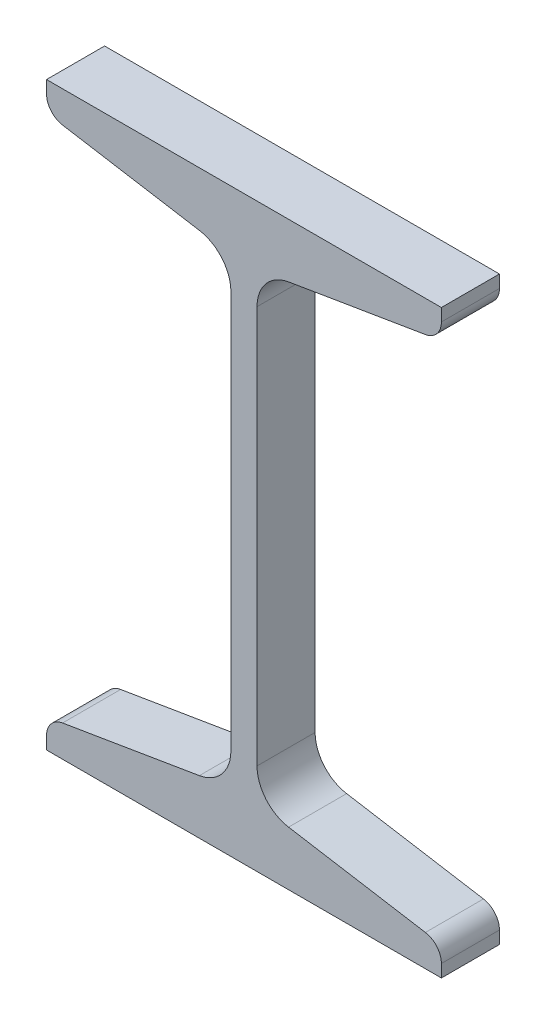
ISO-10303-21;
HEADER;
FILE_DESCRIPTION(('STEP AP214'),'2;1');
FILE_NAME('part.step','',(''),(''),'','','');
FILE_SCHEMA(('AUTOMOTIVE_DESIGN { 1 0 10303 214 1 1 1 1 }'));
ENDSEC;
DATA;
#1=APPLICATION_CONTEXT('core data for automotive mechanical design processes');
#2=APPLICATION_PROTOCOL_DEFINITION('international standard','automotive_design',2000,#1);
#3=PRODUCT_CONTEXT('',#1,'mechanical');
#4=PRODUCT('Part','Part','',(#3));
#5=PRODUCT_RELATED_PRODUCT_CATEGORY('part','',(#4));
#6=PRODUCT_DEFINITION_FORMATION('','',#4);
#7=PRODUCT_DEFINITION_CONTEXT('part definition',#1,'design');
#8=PRODUCT_DEFINITION('design','',#6,#7);
#9=PRODUCT_DEFINITION_SHAPE('','',#8);
#10=(LENGTH_UNIT() NAMED_UNIT(*) SI_UNIT(.MILLI.,.METRE.));
#11=(NAMED_UNIT(*) PLANE_ANGLE_UNIT() SI_UNIT($,.RADIAN.));
#12=(NAMED_UNIT(*) SI_UNIT($,.STERADIAN.) SOLID_ANGLE_UNIT());
#13=UNCERTAINTY_MEASURE_WITH_UNIT(LENGTH_MEASURE(1.E-05),#10,'distance_accuracy_value','');
#14=(GEOMETRIC_REPRESENTATION_CONTEXT(3) GLOBAL_UNCERTAINTY_ASSIGNED_CONTEXT((#13)) GLOBAL_UNIT_ASSIGNED_CONTEXT((#10,
#11,#12)) REPRESENTATION_CONTEXT('',''));
#15=CARTESIAN_POINT('',(0.,0.,0.));
#16=DIRECTION('',(0.,0.,1.));
#17=DIRECTION('',(1.,0.,0.));
#18=AXIS2_PLACEMENT_3D('',#15,#16,#17);
#19=CARTESIAN_POINT('',(34.,-50.,10.));
#20=DIRECTION('',(-1.,0.,0.));
#21=DIRECTION('',(0.,0.,1.));
#22=AXIS2_PLACEMENT_3D('',#19,#20,#21);
#23=PLANE('',#22);
#24=DIRECTION('',(0.,1.,0.));
#25=VECTOR('',#24,1.);
#26=CARTESIAN_POINT('',(34.,-50.,0.));
#27=LINE('',#26,#25);
#28=CARTESIAN_POINT('',(34.,-50.,0.));
#29=VERTEX_POINT('',#28);
#30=CARTESIAN_POINT('',(34.,-47.8413527249973,0.));
#31=VERTEX_POINT('',#30);
#32=EDGE_CURVE('E215',#29,#31,#27,.T.);
#33=ORIENTED_EDGE('',*,*,#32,.T.);
#34=DIRECTION('',(0.,0.,-1.));
#35=VECTOR('',#34,1.);
#36=CARTESIAN_POINT('',(34.,-47.8413527249973,10.));
#37=LINE('',#36,#35);
#38=CARTESIAN_POINT('',(34.,-47.8413527249973,10.));
#39=VERTEX_POINT('',#38);
#40=EDGE_CURVE('E263',#31,#39,#37,.F.);
#41=ORIENTED_EDGE('',*,*,#40,.T.);
#42=DIRECTION('',(0.,1.,0.));
#43=VECTOR('',#42,1.);
#44=CARTESIAN_POINT('',(34.,-50.,10.));
#45=LINE('',#44,#43);
#46=CARTESIAN_POINT('',(34.,-50.,10.));
#47=VERTEX_POINT('',#46);
#48=EDGE_CURVE('E244',#47,#39,#45,.T.);
#49=ORIENTED_EDGE('',*,*,#48,.F.);
#50=DIRECTION('',(0.,0.,-1.));
#51=VECTOR('',#50,1.);
#52=CARTESIAN_POINT('',(34.,-50.,10.));
#53=LINE('',#52,#51);
#54=EDGE_CURVE('E214',#47,#29,#53,.T.);
#55=ORIENTED_EDGE('',*,*,#54,.T.);
#56=EDGE_LOOP('',(#33,#41,#49,#55));
#57=FACE_BOUND('',#56,.T.);
#58=ADVANCED_FACE('F35',(#57),#23,.F.);
#59=CARTESIAN_POINT('',(34.,-45.0458333333332,10.));
#60=DIRECTION('',(-0.164398987305351,-0.986393923832145,0.));
#61=DIRECTION('',(0.986393923832145,-0.164398987305351,0.));
#62=AXIS2_PLACEMENT_3D('',#59,#60,#61);
#63=PLANE('',#62);
#64=DIRECTION('',(-0.986393923832145,0.164398987305351,0.));
#65=VECTOR('',#64,1.);
#66=CARTESIAN_POINT('',(34.,-45.0458333333332,0.));
#67=LINE('',#66,#65);
#68=CARTESIAN_POINT('',(31.2425166581077,-44.5862527763512,0.));
#69=VERTEX_POINT('',#68);
#70=CARTESIAN_POINT('',(7.68140658251523,-40.6594010970859,0.));
#71=VERTEX_POINT('',#70);
#72=EDGE_CURVE('E218',#69,#71,#67,.T.);
#73=ORIENTED_EDGE('',*,*,#72,.T.);
#74=DIRECTION('',(0.,0.,-1.));
#75=VECTOR('',#74,1.);
#76=CARTESIAN_POINT('',(7.68140658251523,-40.6594010970859,10.));
#77=LINE('',#76,#75);
#78=CARTESIAN_POINT('',(7.68140658251523,-40.6594010970859,10.));
#79=VERTEX_POINT('',#78);
#80=EDGE_CURVE('E303',#71,#79,#77,.F.);
#81=ORIENTED_EDGE('',*,*,#80,.T.);
#82=DIRECTION('',(-0.986393923832145,0.164398987305351,0.));
#83=VECTOR('',#82,1.);
#84=CARTESIAN_POINT('',(34.,-45.0458333333332,10.));
#85=LINE('',#84,#83);
#86=CARTESIAN_POINT('',(31.2425166581077,-44.5862527763512,10.));
#87=VERTEX_POINT('',#86);
#88=EDGE_CURVE('E331',#87,#79,#85,.T.);
#89=ORIENTED_EDGE('',*,*,#88,.F.);
#90=DIRECTION('',(0.,0.,-1.));
#91=VECTOR('',#90,1.);
#92=CARTESIAN_POINT('',(31.2425166581077,-44.5862527763512,10.));
#93=LINE('',#92,#91);
#94=EDGE_CURVE('E191',#87,#69,#93,.T.);
#95=ORIENTED_EDGE('',*,*,#94,.T.);
#96=EDGE_LOOP('',(#73,#81,#89,#95));
#97=FACE_BOUND('',#96,.T.);
#98=ADVANCED_FACE('F347',(#97),#63,.F.);
#99=CARTESIAN_POINT('',(2.25000000000001,39.7541666666668,10.));
#100=DIRECTION('',(-1.,0.,0.));
#101=DIRECTION('',(0.,0.,1.));
#102=AXIS2_PLACEMENT_3D('',#99,#100,#101);
#103=PLANE('',#102);
#104=DIRECTION('',(0.,1.,0.));
#105=VECTOR('',#104,1.);
#106=CARTESIAN_POINT('',(2.25000000000001,39.7541666666668,10.));
#107=LINE('',#106,#105);
#108=CARTESIAN_POINT('',(2.25000000000001,-34.247840592177,10.));
#109=VERTEX_POINT('',#108);
#110=CARTESIAN_POINT('',(2.25000000000001,34.247840592177,10.));
#111=VERTEX_POINT('',#110);
#112=EDGE_CURVE('E330',#109,#111,#107,.T.);
#113=ORIENTED_EDGE('',*,*,#112,.F.);
#114=DIRECTION('',(0.,0.,-1.));
#115=VECTOR('',#114,1.);
#116=CARTESIAN_POINT('',(2.25000000000001,-34.247840592177,0.));
#117=LINE('',#116,#115);
#118=CARTESIAN_POINT('',(2.25000000000001,-34.247840592177,0.));
#119=VERTEX_POINT('',#118);
#120=EDGE_CURVE('E300',#109,#119,#117,.T.);
#121=ORIENTED_EDGE('',*,*,#120,.T.);
#122=DIRECTION('',(0.,1.,0.));
#123=VECTOR('',#122,1.);
#124=CARTESIAN_POINT('',(2.25000000000001,39.7541666666668,0.));
#125=LINE('',#124,#123);
#126=CARTESIAN_POINT('',(2.25000000000001,34.247840592177,0.));
#127=VERTEX_POINT('',#126);
#128=EDGE_CURVE('E221',#119,#127,#125,.T.);
#129=ORIENTED_EDGE('',*,*,#128,.T.);
#130=DIRECTION('',(0.,0.,-1.));
#131=VECTOR('',#130,1.);
#132=CARTESIAN_POINT('',(2.25000000000001,34.247840592177,10.));
#133=LINE('',#132,#131);
#134=EDGE_CURVE('E298',#127,#111,#133,.F.);
#135=ORIENTED_EDGE('',*,*,#134,.T.);
#136=EDGE_LOOP('',(#113,#121,#129,#135));
#137=FACE_BOUND('',#136,.T.);
#138=ADVANCED_FACE('F325',(#137),#103,.F.);
#139=CARTESIAN_POINT('',(34.,45.0458333333332,10.));
#140=DIRECTION('',(-0.164398987305351,0.986393923832145,0.));
#141=DIRECTION('',(-0.986393923832145,-0.164398987305351,0.));
#142=AXIS2_PLACEMENT_3D('',#139,#140,#141);
#143=PLANE('',#142);
#144=DIRECTION('',(0.986393923832145,0.164398987305351,0.));
#145=VECTOR('',#144,1.);
#146=CARTESIAN_POINT('',(34.,45.0458333333332,10.));
#147=LINE('',#146,#145);
#148=CARTESIAN_POINT('',(7.68140658251523,40.6594010970859,10.));
#149=VERTEX_POINT('',#148);
#150=CARTESIAN_POINT('',(31.2425166581077,44.5862527763512,10.));
#151=VERTEX_POINT('',#150);
#152=EDGE_CURVE('E182',#149,#151,#147,.T.);
#153=ORIENTED_EDGE('',*,*,#152,.F.);
#154=DIRECTION('',(0.,0.,-1.));
#155=VECTOR('',#154,1.);
#156=CARTESIAN_POINT('',(7.68140658251523,40.6594010970859,0.));
#157=LINE('',#156,#155);
#158=CARTESIAN_POINT('',(7.68140658251523,40.6594010970859,0.));
#159=VERTEX_POINT('',#158);
#160=EDGE_CURVE('E305',#149,#159,#157,.T.);
#161=ORIENTED_EDGE('',*,*,#160,.T.);
#162=DIRECTION('',(0.986393923832145,0.164398987305351,0.));
#163=VECTOR('',#162,1.);
#164=CARTESIAN_POINT('',(34.,45.0458333333332,0.));
#165=LINE('',#164,#163);
#166=CARTESIAN_POINT('',(31.2425166581077,44.5862527763512,0.));
#167=VERTEX_POINT('',#166);
#168=EDGE_CURVE('E224',#159,#167,#165,.T.);
#169=ORIENTED_EDGE('',*,*,#168,.T.);
#170=DIRECTION('',(0.,0.,-1.));
#171=VECTOR('',#170,1.);
#172=CARTESIAN_POINT('',(31.2425166581077,44.5862527763512,10.));
#173=LINE('',#172,#171);
#174=EDGE_CURVE('E285',#167,#151,#173,.F.);
#175=ORIENTED_EDGE('',*,*,#174,.T.);
#176=EDGE_LOOP('',(#153,#161,#169,#175));
#177=FACE_BOUND('',#176,.T.);
#178=ADVANCED_FACE('F328',(#177),#143,.F.);
#179=CARTESIAN_POINT('',(34.,50.,10.));
#180=DIRECTION('',(-1.,0.,0.));
#181=DIRECTION('',(0.,0.,1.));
#182=AXIS2_PLACEMENT_3D('',#179,#180,#181);
#183=PLANE('',#182);
#184=DIRECTION('',(0.,1.,0.));
#185=VECTOR('',#184,1.);
#186=CARTESIAN_POINT('',(34.,50.,10.));
#187=LINE('',#186,#185);
#188=CARTESIAN_POINT('',(34.,47.8413527249973,10.));
#189=VERTEX_POINT('',#188);
#190=CARTESIAN_POINT('',(34.,50.,10.));
#191=VERTEX_POINT('',#190);
#192=EDGE_CURVE('E169',#189,#191,#187,.T.);
#193=ORIENTED_EDGE('',*,*,#192,.F.);
#194=DIRECTION('',(0.,0.,-1.));
#195=VECTOR('',#194,1.);
#196=CARTESIAN_POINT('',(34.,47.8413527249973,10.));
#197=LINE('',#196,#195);
#198=CARTESIAN_POINT('',(34.,47.8413527249973,0.));
#199=VERTEX_POINT('',#198);
#200=EDGE_CURVE('E283',#189,#199,#197,.T.);
#201=ORIENTED_EDGE('',*,*,#200,.T.);
#202=DIRECTION('',(0.,1.,0.));
#203=VECTOR('',#202,1.);
#204=CARTESIAN_POINT('',(34.,50.,0.));
#205=LINE('',#204,#203);
#206=CARTESIAN_POINT('',(34.,50.,0.));
#207=VERTEX_POINT('',#206);
#208=EDGE_CURVE('E188',#199,#207,#205,.T.);
#209=ORIENTED_EDGE('',*,*,#208,.T.);
#210=DIRECTION('',(0.,0.,-1.));
#211=VECTOR('',#210,1.);
#212=CARTESIAN_POINT('',(34.,50.,10.));
#213=LINE('',#212,#211);
#214=EDGE_CURVE('E185',#191,#207,#213,.T.);
#215=ORIENTED_EDGE('',*,*,#214,.F.);
#216=EDGE_LOOP('',(#193,#201,#209,#215));
#217=FACE_BOUND('',#216,.T.);
#218=ADVANCED_FACE('F186',(#217),#183,.F.);
#219=CARTESIAN_POINT('',(34.,50.,10.));
#220=DIRECTION('',(0.,-1.,0.));
#221=DIRECTION('',(1.,0.,0.));
#222=AXIS2_PLACEMENT_3D('',#219,#220,#221);
#223=PLANE('',#222);
#224=DIRECTION('',(-1.,0.,0.));
#225=VECTOR('',#224,1.);
#226=CARTESIAN_POINT('',(34.,50.,0.));
#227=LINE('',#226,#225);
#228=CARTESIAN_POINT('',(-34.,50.,0.));
#229=VERTEX_POINT('',#228);
#230=EDGE_CURVE('E227',#207,#229,#227,.T.);
#231=ORIENTED_EDGE('',*,*,#230,.T.);
#232=DIRECTION('',(0.,0.,-1.));
#233=VECTOR('',#232,1.);
#234=CARTESIAN_POINT('',(-34.,50.,10.));
#235=LINE('',#234,#233);
#236=CARTESIAN_POINT('',(-34.,50.,10.));
#237=VERTEX_POINT('',#236);
#238=EDGE_CURVE('E192',#237,#229,#235,.T.);
#239=ORIENTED_EDGE('',*,*,#238,.F.);
#240=DIRECTION('',(-1.,0.,0.));
#241=VECTOR('',#240,1.);
#242=CARTESIAN_POINT('',(34.,50.,10.));
#243=LINE('',#242,#241);
#244=EDGE_CURVE('E175',#191,#237,#243,.T.);
#245=ORIENTED_EDGE('',*,*,#244,.F.);
#246=ORIENTED_EDGE('',*,*,#214,.T.);
#247=EDGE_LOOP('',(#231,#239,#245,#246));
#248=FACE_BOUND('',#247,.T.);
#249=ADVANCED_FACE('F194',(#248),#223,.F.);
#250=CARTESIAN_POINT('',(-34.,50.,10.));
#251=DIRECTION('',(1.,0.,0.));
#252=DIRECTION('',(0.,0.,-1.));
#253=AXIS2_PLACEMENT_3D('',#250,#251,#252);
#254=PLANE('',#253);
#255=DIRECTION('',(0.,-1.,0.));
#256=VECTOR('',#255,1.);
#257=CARTESIAN_POINT('',(-34.,50.,0.));
#258=LINE('',#257,#256);
#259=CARTESIAN_POINT('',(-34.,47.8413527249972,0.));
#260=VERTEX_POINT('',#259);
#261=EDGE_CURVE('E229',#229,#260,#258,.T.);
#262=ORIENTED_EDGE('',*,*,#261,.T.);
#263=DIRECTION('',(0.,0.,-1.));
#264=VECTOR('',#263,1.);
#265=CARTESIAN_POINT('',(-34.,47.8413527249972,10.));
#266=LINE('',#265,#264);
#267=CARTESIAN_POINT('',(-34.,47.8413527249972,10.));
#268=VERTEX_POINT('',#267);
#269=EDGE_CURVE('E281',#260,#268,#266,.F.);
#270=ORIENTED_EDGE('',*,*,#269,.T.);
#271=DIRECTION('',(0.,-1.,0.));
#272=VECTOR('',#271,1.);
#273=CARTESIAN_POINT('',(-34.,50.,10.));
#274=LINE('',#273,#272);
#275=EDGE_CURVE('E197',#237,#268,#274,.T.);
#276=ORIENTED_EDGE('',*,*,#275,.F.);
#277=ORIENTED_EDGE('',*,*,#238,.T.);
#278=EDGE_LOOP('',(#262,#270,#276,#277));
#279=FACE_BOUND('',#278,.T.);
#280=ADVANCED_FACE('F422',(#279),#254,.F.);
#281=CARTESIAN_POINT('',(-34.,45.0458333333332,10.));
#282=DIRECTION('',(0.164398987305351,0.986393923832145,0.));
#283=DIRECTION('',(-0.986393923832145,0.164398987305351,0.));
#284=AXIS2_PLACEMENT_3D('',#281,#282,#283);
#285=PLANE('',#284);
#286=DIRECTION('',(0.986393923832145,-0.164398987305351,0.));
#287=VECTOR('',#286,1.);
#288=CARTESIAN_POINT('',(-34.,45.0458333333332,0.));
#289=LINE('',#288,#287);
#290=CARTESIAN_POINT('',(-31.2425166581077,44.5862527763512,0.));
#291=VERTEX_POINT('',#290);
#292=CARTESIAN_POINT('',(-7.68140658251523,40.6594010970859,0.));
#293=VERTEX_POINT('',#292);
#294=EDGE_CURVE('E232',#291,#293,#289,.T.);
#295=ORIENTED_EDGE('',*,*,#294,.T.);
#296=DIRECTION('',(0.,0.,-1.));
#297=VECTOR('',#296,1.);
#298=CARTESIAN_POINT('',(-7.68140658251523,40.6594010970859,10.));
#299=LINE('',#298,#297);
#300=CARTESIAN_POINT('',(-7.68140658251523,40.6594010970859,10.));
#301=VERTEX_POINT('',#300);
#302=EDGE_CURVE('E296',#293,#301,#299,.F.);
#303=ORIENTED_EDGE('',*,*,#302,.T.);
#304=DIRECTION('',(0.986393923832145,-0.164398987305351,0.));
#305=VECTOR('',#304,1.);
#306=CARTESIAN_POINT('',(-34.,45.0458333333332,10.));
#307=LINE('',#306,#305);
#308=CARTESIAN_POINT('',(-31.2425166581077,44.5862527763512,10.));
#309=VERTEX_POINT('',#308);
#310=EDGE_CURVE('E199',#309,#301,#307,.T.);
#311=ORIENTED_EDGE('',*,*,#310,.F.);
#312=DIRECTION('',(0.,0.,-1.));
#313=VECTOR('',#312,1.);
#314=CARTESIAN_POINT('',(-31.2425166581077,44.5862527763512,10.));
#315=LINE('',#314,#313);
#316=EDGE_CURVE('E278',#309,#291,#315,.T.);
#317=ORIENTED_EDGE('',*,*,#316,.T.);
#318=EDGE_LOOP('',(#295,#303,#311,#317));
#319=FACE_BOUND('',#318,.T.);
#320=ADVANCED_FACE('F415',(#319),#285,.F.);
#321=CARTESIAN_POINT('',(-2.25000000000001,39.7541666666668,10.));
#322=DIRECTION('',(1.,0.,0.));
#323=DIRECTION('',(0.,1.,0.));
#324=AXIS2_PLACEMENT_3D('',#321,#322,#323);
#325=PLANE('',#324);
#326=DIRECTION('',(0.,-1.,0.));
#327=VECTOR('',#326,1.);
#328=CARTESIAN_POINT('',(-2.25000000000001,39.7541666666668,0.));
#329=LINE('',#328,#327);
#330=CARTESIAN_POINT('',(-2.25000000000001,34.247840592177,0.));
#331=VERTEX_POINT('',#330);
#332=CARTESIAN_POINT('',(-2.24999999999999,-34.247840592177,0.));
#333=VERTEX_POINT('',#332);
#334=EDGE_CURVE('E235',#331,#333,#329,.T.);
#335=ORIENTED_EDGE('',*,*,#334,.T.);
#336=DIRECTION('',(0.,0.,-1.));
#337=VECTOR('',#336,1.);
#338=CARTESIAN_POINT('',(-2.24999999999999,-34.247840592177,10.));
#339=LINE('',#338,#337);
#340=CARTESIAN_POINT('',(-2.24999999999999,-34.247840592177,10.));
#341=VERTEX_POINT('',#340);
#342=EDGE_CURVE('E294',#333,#341,#339,.F.);
#343=ORIENTED_EDGE('',*,*,#342,.T.);
#344=DIRECTION('',(0.,-1.,0.));
#345=VECTOR('',#344,1.);
#346=CARTESIAN_POINT('',(-2.25000000000001,39.7541666666668,10.));
#347=LINE('',#346,#345);
#348=CARTESIAN_POINT('',(-2.25000000000001,34.247840592177,10.));
#349=VERTEX_POINT('',#348);
#350=EDGE_CURVE('E205',#349,#341,#347,.T.);
#351=ORIENTED_EDGE('',*,*,#350,.F.);
#352=DIRECTION('',(0.,0.,-1.));
#353=VECTOR('',#352,1.);
#354=CARTESIAN_POINT('',(-2.25000000000001,34.247840592177,0.));
#355=LINE('',#354,#353);
#356=EDGE_CURVE('E291',#349,#331,#355,.T.);
#357=ORIENTED_EDGE('',*,*,#356,.T.);
#358=EDGE_LOOP('',(#335,#343,#351,#357));
#359=FACE_BOUND('',#358,.T.);
#360=ADVANCED_FACE('F409',(#359),#325,.F.);
#361=CARTESIAN_POINT('',(-34.,-45.0458333333332,10.));
#362=DIRECTION('',(0.164398987305351,-0.986393923832145,0.));
#363=DIRECTION('',(0.986393923832145,0.164398987305351,0.));
#364=AXIS2_PLACEMENT_3D('',#361,#362,#363);
#365=PLANE('',#364);
#366=DIRECTION('',(-0.986393923832145,-0.164398987305351,0.));
#367=VECTOR('',#366,1.);
#368=CARTESIAN_POINT('',(-34.,-45.0458333333332,10.));
#369=LINE('',#368,#367);
#370=CARTESIAN_POINT('',(-7.68140658251521,-40.6594010970859,10.));
#371=VERTEX_POINT('',#370);
#372=CARTESIAN_POINT('',(-31.2425166581076,-44.5862527763512,10.));
#373=VERTEX_POINT('',#372);
#374=EDGE_CURVE('E208',#371,#373,#369,.T.);
#375=ORIENTED_EDGE('',*,*,#374,.F.);
#376=DIRECTION('',(0.,0.,-1.));
#377=VECTOR('',#376,1.);
#378=CARTESIAN_POINT('',(-7.6814065825152,-40.6594010970859,0.));
#379=LINE('',#378,#377);
#380=CARTESIAN_POINT('',(-7.68140658251521,-40.6594010970859,0.));
#381=VERTEX_POINT('',#380);
#382=EDGE_CURVE('E288',#371,#381,#379,.T.);
#383=ORIENTED_EDGE('',*,*,#382,.T.);
#384=DIRECTION('',(-0.986393923832145,-0.164398987305351,0.));
#385=VECTOR('',#384,1.);
#386=CARTESIAN_POINT('',(-34.,-45.0458333333332,0.));
#387=LINE('',#386,#385);
#388=CARTESIAN_POINT('',(-31.2425166581076,-44.5862527763512,0.));
#389=VERTEX_POINT('',#388);
#390=EDGE_CURVE('E238',#381,#389,#387,.T.);
#391=ORIENTED_EDGE('',*,*,#390,.T.);
#392=DIRECTION('',(0.,0.,-1.));
#393=VECTOR('',#392,1.);
#394=CARTESIAN_POINT('',(-31.2425166581076,-44.5862527763512,10.));
#395=LINE('',#394,#393);
#396=EDGE_CURVE('E275',#389,#373,#395,.F.);
#397=ORIENTED_EDGE('',*,*,#396,.T.);
#398=EDGE_LOOP('',(#375,#383,#391,#397));
#399=FACE_BOUND('',#398,.T.);
#400=ADVANCED_FACE('F394',(#399),#365,.F.);
#401=CARTESIAN_POINT('',(-34.,-50.,10.));
#402=DIRECTION('',(1.,0.,0.));
#403=DIRECTION('',(0.,0.,-1.));
#404=AXIS2_PLACEMENT_3D('',#401,#402,#403);
#405=PLANE('',#404);
#406=DIRECTION('',(0.,-1.,0.));
#407=VECTOR('',#406,1.);
#408=CARTESIAN_POINT('',(-34.,-50.,10.));
#409=LINE('',#408,#407);
#410=CARTESIAN_POINT('',(-34.,-47.8413527249973,10.));
#411=VERTEX_POINT('',#410);
#412=CARTESIAN_POINT('',(-34.,-50.,10.));
#413=VERTEX_POINT('',#412);
#414=EDGE_CURVE('E210',#411,#413,#409,.T.);
#415=ORIENTED_EDGE('',*,*,#414,.F.);
#416=DIRECTION('',(0.,0.,-1.));
#417=VECTOR('',#416,1.);
#418=CARTESIAN_POINT('',(-34.,-47.8413527249973,10.));
#419=LINE('',#418,#417);
#420=CARTESIAN_POINT('',(-34.,-47.8413527249973,0.));
#421=VERTEX_POINT('',#420);
#422=EDGE_CURVE('E272',#411,#421,#419,.T.);
#423=ORIENTED_EDGE('',*,*,#422,.T.);
#424=DIRECTION('',(0.,-1.,0.));
#425=VECTOR('',#424,1.);
#426=CARTESIAN_POINT('',(-34.,-50.,0.));
#427=LINE('',#426,#425);
#428=CARTESIAN_POINT('',(-34.,-50.,0.));
#429=VERTEX_POINT('',#428);
#430=EDGE_CURVE('E240',#421,#429,#427,.T.);
#431=ORIENTED_EDGE('',*,*,#430,.T.);
#432=DIRECTION('',(0.,0.,-1.));
#433=VECTOR('',#432,1.);
#434=CARTESIAN_POINT('',(-34.,-50.,10.));
#435=LINE('',#434,#433);
#436=EDGE_CURVE('E247',#413,#429,#435,.T.);
#437=ORIENTED_EDGE('',*,*,#436,.F.);
#438=EDGE_LOOP('',(#415,#423,#431,#437));
#439=FACE_BOUND('',#438,.T.);
#440=ADVANCED_FACE('F402',(#439),#405,.F.);
#441=CARTESIAN_POINT('',(34.,-50.,10.));
#442=DIRECTION('',(0.,1.,0.));
#443=DIRECTION('',(-1.,0.,0.));
#444=AXIS2_PLACEMENT_3D('',#441,#442,#443);
#445=PLANE('',#444);
#446=DIRECTION('',(1.,0.,0.));
#447=VECTOR('',#446,1.);
#448=CARTESIAN_POINT('',(34.,-50.,0.));
#449=LINE('',#448,#447);
#450=EDGE_CURVE('E242',#429,#29,#449,.T.);
#451=ORIENTED_EDGE('',*,*,#450,.T.);
#452=ORIENTED_EDGE('',*,*,#54,.F.);
#453=DIRECTION('',(1.,0.,0.));
#454=VECTOR('',#453,1.);
#455=CARTESIAN_POINT('',(34.,-50.,10.));
#456=LINE('',#455,#454);
#457=EDGE_CURVE('E212',#413,#47,#456,.T.);
#458=ORIENTED_EDGE('',*,*,#457,.F.);
#459=ORIENTED_EDGE('',*,*,#436,.T.);
#460=EDGE_LOOP('',(#451,#452,#458,#459));
#461=FACE_BOUND('',#460,.T.);
#462=ADVANCED_FACE('F406',(#461),#445,.F.);
#463=CARTESIAN_POINT('',(34.,50.,10.));
#464=DIRECTION('',(0.,0.,1.));
#465=DIRECTION('',(1.,0.,0.));
#466=AXIS2_PLACEMENT_3D('',#463,#464,#465);
#467=PLANE('',#466);
#468=ORIENTED_EDGE('',*,*,#48,.T.);
#469=CARTESIAN_POINT('',(30.7,-47.8413527249973,10.));
#470=DIRECTION('',(0.,0.,1.));
#471=DIRECTION('',(1.,0.,0.));
#472=AXIS2_PLACEMENT_3D('',#469,#470,#471);
#473=CIRCLE('',#472,3.3);
#474=EDGE_CURVE('E270',#39,#87,#473,.T.);
#475=ORIENTED_EDGE('',*,*,#474,.T.);
#476=ORIENTED_EDGE('',*,*,#88,.T.);
#477=CARTESIAN_POINT('',(8.75000000000001,-34.247840592177,10.));
#478=DIRECTION('',(0.,0.,1.));
#479=DIRECTION('',(1.,0.,0.));
#480=AXIS2_PLACEMENT_3D('',#477,#478,#479);
#481=CIRCLE('',#480,6.5);
#482=EDGE_CURVE('E317',#79,#109,#481,.F.);
#483=ORIENTED_EDGE('',*,*,#482,.T.);
#484=ORIENTED_EDGE('',*,*,#112,.T.);
#485=CARTESIAN_POINT('',(8.75000000000001,34.247840592177,10.));
#486=DIRECTION('',(0.,0.,1.));
#487=DIRECTION('',(1.,0.,0.));
#488=AXIS2_PLACEMENT_3D('',#485,#486,#487);
#489=CIRCLE('',#488,6.5);
#490=EDGE_CURVE('E11',#111,#149,#489,.F.);
#491=ORIENTED_EDGE('',*,*,#490,.T.);
#492=ORIENTED_EDGE('',*,*,#152,.T.);
#493=CARTESIAN_POINT('',(30.7,47.8413527249973,10.));
#494=DIRECTION('',(0.,0.,1.));
#495=DIRECTION('',(1.,0.,0.));
#496=AXIS2_PLACEMENT_3D('',#493,#494,#495);
#497=CIRCLE('',#496,3.3);
#498=EDGE_CURVE('E178',#151,#189,#497,.T.);
#499=ORIENTED_EDGE('',*,*,#498,.T.);
#500=ORIENTED_EDGE('',*,*,#192,.T.);
#501=ORIENTED_EDGE('',*,*,#244,.T.);
#502=ORIENTED_EDGE('',*,*,#275,.T.);
#503=CARTESIAN_POINT('',(-30.7,47.8413527249972,10.));
#504=DIRECTION('',(0.,0.,1.));
#505=DIRECTION('',(1.,0.,0.));
#506=AXIS2_PLACEMENT_3D('',#503,#504,#505);
#507=CIRCLE('',#506,3.3);
#508=EDGE_CURVE('E266',#268,#309,#507,.T.);
#509=ORIENTED_EDGE('',*,*,#508,.T.);
#510=ORIENTED_EDGE('',*,*,#310,.T.);
#511=CARTESIAN_POINT('',(-8.75000000000001,34.247840592177,10.));
#512=DIRECTION('',(0.,0.,1.));
#513=DIRECTION('',(1.,0.,0.));
#514=AXIS2_PLACEMENT_3D('',#511,#512,#513);
#515=CIRCLE('',#514,6.5);
#516=EDGE_CURVE('E313',#301,#349,#515,.F.);
#517=ORIENTED_EDGE('',*,*,#516,.T.);
#518=ORIENTED_EDGE('',*,*,#350,.T.);
#519=CARTESIAN_POINT('',(-8.74999999999999,-34.247840592177,10.));
#520=DIRECTION('',(0.,0.,1.));
#521=DIRECTION('',(1.,0.,0.));
#522=AXIS2_PLACEMENT_3D('',#519,#520,#521);
#523=CIRCLE('',#522,6.5);
#524=EDGE_CURVE('E309',#341,#371,#523,.F.);
#525=ORIENTED_EDGE('',*,*,#524,.T.);
#526=ORIENTED_EDGE('',*,*,#374,.T.);
#527=CARTESIAN_POINT('',(-30.7,-47.8413527249973,10.));
#528=DIRECTION('',(0.,0.,1.));
#529=DIRECTION('',(1.,0.,0.));
#530=AXIS2_PLACEMENT_3D('',#527,#528,#529);
#531=CIRCLE('',#530,3.3);
#532=EDGE_CURVE('E268',#373,#411,#531,.T.);
#533=ORIENTED_EDGE('',*,*,#532,.T.);
#534=ORIENTED_EDGE('',*,*,#414,.T.);
#535=ORIENTED_EDGE('',*,*,#457,.T.);
#536=EDGE_LOOP('',(#468,#475,#476,#483,#484,#491,#492,#499,#500,#501,#502,#509,#510,#517,#518,
#525,#526,#533,#534,#535));
#537=FACE_BOUND('',#536,.T.);
#538=ADVANCED_FACE('F172',(#537),#467,.T.);
#539=CARTESIAN_POINT('',(34.,50.,0.));
#540=DIRECTION('',(0.,0.,1.));
#541=DIRECTION('',(1.,0.,0.));
#542=AXIS2_PLACEMENT_3D('',#539,#540,#541);
#543=PLANE('',#542);
#544=ORIENTED_EDGE('',*,*,#72,.F.);
#545=CARTESIAN_POINT('',(30.7,-47.8413527249973,0.));
#546=DIRECTION('',(0.,0.,1.));
#547=DIRECTION('',(1.,0.,0.));
#548=AXIS2_PLACEMENT_3D('',#545,#546,#547);
#549=CIRCLE('',#548,3.3);
#550=EDGE_CURVE('E261',#69,#31,#549,.F.);
#551=ORIENTED_EDGE('',*,*,#550,.T.);
#552=ORIENTED_EDGE('',*,*,#32,.F.);
#553=ORIENTED_EDGE('',*,*,#450,.F.);
#554=ORIENTED_EDGE('',*,*,#430,.F.);
#555=CARTESIAN_POINT('',(-30.7,-47.8413527249973,0.));
#556=DIRECTION('',(0.,0.,1.));
#557=DIRECTION('',(1.,0.,0.));
#558=AXIS2_PLACEMENT_3D('',#555,#556,#557);
#559=CIRCLE('',#558,3.3);
#560=EDGE_CURVE('E258',#421,#389,#559,.F.);
#561=ORIENTED_EDGE('',*,*,#560,.T.);
#562=ORIENTED_EDGE('',*,*,#390,.F.);
#563=CARTESIAN_POINT('',(-8.74999999999999,-34.247840592177,0.));
#564=DIRECTION('',(0.,0.,1.));
#565=DIRECTION('',(1.,0.,0.));
#566=AXIS2_PLACEMENT_3D('',#563,#564,#565);
#567=CIRCLE('',#566,6.5);
#568=EDGE_CURVE('E307',#381,#333,#567,.T.);
#569=ORIENTED_EDGE('',*,*,#568,.T.);
#570=ORIENTED_EDGE('',*,*,#334,.F.);
#571=CARTESIAN_POINT('',(-8.75000000000001,34.247840592177,0.));
#572=DIRECTION('',(0.,0.,1.));
#573=DIRECTION('',(1.,0.,0.));
#574=AXIS2_PLACEMENT_3D('',#571,#572,#573);
#575=CIRCLE('',#574,6.5);
#576=EDGE_CURVE('E311',#331,#293,#575,.T.);
#577=ORIENTED_EDGE('',*,*,#576,.T.);
#578=ORIENTED_EDGE('',*,*,#294,.F.);
#579=CARTESIAN_POINT('',(-30.7,47.8413527249972,0.));
#580=DIRECTION('',(0.,0.,1.));
#581=DIRECTION('',(1.,0.,0.));
#582=AXIS2_PLACEMENT_3D('',#579,#580,#581);
#583=CIRCLE('',#582,3.3);
#584=EDGE_CURVE('E256',#291,#260,#583,.F.);
#585=ORIENTED_EDGE('',*,*,#584,.T.);
#586=ORIENTED_EDGE('',*,*,#261,.F.);
#587=ORIENTED_EDGE('',*,*,#230,.F.);
#588=ORIENTED_EDGE('',*,*,#208,.F.);
#589=CARTESIAN_POINT('',(30.7,47.8413527249973,0.));
#590=DIRECTION('',(0.,0.,1.));
#591=DIRECTION('',(1.,0.,0.));
#592=AXIS2_PLACEMENT_3D('',#589,#590,#591);
#593=CIRCLE('',#592,3.3);
#594=EDGE_CURVE('E253',#199,#167,#593,.F.);
#595=ORIENTED_EDGE('',*,*,#594,.T.);
#596=ORIENTED_EDGE('',*,*,#168,.F.);
#597=CARTESIAN_POINT('',(8.75000000000001,34.247840592177,0.));
#598=DIRECTION('',(0.,0.,1.));
#599=DIRECTION('',(1.,0.,0.));
#600=AXIS2_PLACEMENT_3D('',#597,#598,#599);
#601=CIRCLE('',#600,6.5);
#602=EDGE_CURVE('E43',#159,#127,#601,.T.);
#603=ORIENTED_EDGE('',*,*,#602,.T.);
#604=ORIENTED_EDGE('',*,*,#128,.F.);
#605=CARTESIAN_POINT('',(8.75000000000001,-34.247840592177,0.));
#606=DIRECTION('',(0.,0.,1.));
#607=DIRECTION('',(1.,0.,0.));
#608=AXIS2_PLACEMENT_3D('',#605,#606,#607);
#609=CIRCLE('',#608,6.5);
#610=EDGE_CURVE('E315',#119,#71,#609,.T.);
#611=ORIENTED_EDGE('',*,*,#610,.T.);
#612=EDGE_LOOP('',(#544,#551,#552,#553,#554,#561,#562,#569,#570,#577,#578,#585,#586,#587,#588,
#595,#596,#603,#604,#611));
#613=FACE_BOUND('',#612,.T.);
#614=ADVANCED_FACE('F322',(#613),#543,.F.);
#615=CARTESIAN_POINT('',(30.7,-47.8413527249973,10.));
#616=DIRECTION('',(0.,0.,-1.));
#617=DIRECTION('',(-1.,0.,0.));
#618=AXIS2_PLACEMENT_3D('',#615,#616,#617);
#619=CYLINDRICAL_SURFACE('',#618,3.3);
#620=ORIENTED_EDGE('',*,*,#474,.F.);
#621=ORIENTED_EDGE('',*,*,#40,.F.);
#622=ORIENTED_EDGE('',*,*,#550,.F.);
#623=ORIENTED_EDGE('',*,*,#94,.F.);
#624=EDGE_LOOP('',(#620,#621,#622,#623));
#625=FACE_BOUND('',#624,.T.);
#626=ADVANCED_FACE('F345',(#625),#619,.T.);
#627=CARTESIAN_POINT('',(-30.7,-47.8413527249973,10.));
#628=DIRECTION('',(0.,0.,-1.));
#629=DIRECTION('',(-1.,0.,0.));
#630=AXIS2_PLACEMENT_3D('',#627,#628,#629);
#631=CYLINDRICAL_SURFACE('',#630,3.3);
#632=ORIENTED_EDGE('',*,*,#532,.F.);
#633=ORIENTED_EDGE('',*,*,#396,.F.);
#634=ORIENTED_EDGE('',*,*,#560,.F.);
#635=ORIENTED_EDGE('',*,*,#422,.F.);
#636=EDGE_LOOP('',(#632,#633,#634,#635));
#637=FACE_BOUND('',#636,.T.);
#638=ADVANCED_FACE('F372',(#637),#631,.T.);
#639=CARTESIAN_POINT('',(-30.7,47.8413527249972,10.));
#640=DIRECTION('',(0.,0.,-1.));
#641=DIRECTION('',(-1.,0.,0.));
#642=AXIS2_PLACEMENT_3D('',#639,#640,#641);
#643=CYLINDRICAL_SURFACE('',#642,3.3);
#644=ORIENTED_EDGE('',*,*,#508,.F.);
#645=ORIENTED_EDGE('',*,*,#269,.F.);
#646=ORIENTED_EDGE('',*,*,#584,.F.);
#647=ORIENTED_EDGE('',*,*,#316,.F.);
#648=EDGE_LOOP('',(#644,#645,#646,#647));
#649=FACE_BOUND('',#648,.T.);
#650=ADVANCED_FACE('F375',(#649),#643,.T.);
#651=CARTESIAN_POINT('',(30.7,47.8413527249973,10.));
#652=DIRECTION('',(0.,0.,-1.));
#653=DIRECTION('',(-1.,0.,0.));
#654=AXIS2_PLACEMENT_3D('',#651,#652,#653);
#655=CYLINDRICAL_SURFACE('',#654,3.3);
#656=ORIENTED_EDGE('',*,*,#498,.F.);
#657=ORIENTED_EDGE('',*,*,#174,.F.);
#658=ORIENTED_EDGE('',*,*,#594,.F.);
#659=ORIENTED_EDGE('',*,*,#200,.F.);
#660=EDGE_LOOP('',(#656,#657,#658,#659));
#661=FACE_BOUND('',#660,.T.);
#662=ADVANCED_FACE('F379',(#661),#655,.T.);
#663=CARTESIAN_POINT('',(-8.74999999999999,-34.247840592177,10.));
#664=DIRECTION('',(0.,0.,1.));
#665=DIRECTION('',(1.,0.,0.));
#666=AXIS2_PLACEMENT_3D('',#663,#664,#665);
#667=CYLINDRICAL_SURFACE('',#666,6.5);
#668=ORIENTED_EDGE('',*,*,#524,.F.);
#669=ORIENTED_EDGE('',*,*,#342,.F.);
#670=ORIENTED_EDGE('',*,*,#568,.F.);
#671=ORIENTED_EDGE('',*,*,#382,.F.);
#672=EDGE_LOOP('',(#668,#669,#670,#671));
#673=FACE_BOUND('',#672,.T.);
#674=ADVANCED_FACE('F359',(#673),#667,.F.);
#675=CARTESIAN_POINT('',(-8.75000000000001,34.247840592177,10.));
#676=DIRECTION('',(0.,0.,1.));
#677=DIRECTION('',(1.,0.,0.));
#678=AXIS2_PLACEMENT_3D('',#675,#676,#677);
#679=CYLINDRICAL_SURFACE('',#678,6.5);
#680=ORIENTED_EDGE('',*,*,#516,.F.);
#681=ORIENTED_EDGE('',*,*,#302,.F.);
#682=ORIENTED_EDGE('',*,*,#576,.F.);
#683=ORIENTED_EDGE('',*,*,#356,.F.);
#684=EDGE_LOOP('',(#680,#681,#682,#683));
#685=FACE_BOUND('',#684,.T.);
#686=ADVANCED_FACE('F354',(#685),#679,.F.);
#687=CARTESIAN_POINT('',(8.75000000000001,-34.247840592177,10.));
#688=DIRECTION('',(0.,0.,1.));
#689=DIRECTION('',(1.,0.,0.));
#690=AXIS2_PLACEMENT_3D('',#687,#688,#689);
#691=CYLINDRICAL_SURFACE('',#690,6.5);
#692=ORIENTED_EDGE('',*,*,#482,.F.);
#693=ORIENTED_EDGE('',*,*,#80,.F.);
#694=ORIENTED_EDGE('',*,*,#610,.F.);
#695=ORIENTED_EDGE('',*,*,#120,.F.);
#696=EDGE_LOOP('',(#692,#693,#694,#695));
#697=FACE_BOUND('',#696,.T.);
#698=ADVANCED_FACE('F352',(#697),#691,.F.);
#699=CARTESIAN_POINT('',(8.75000000000001,34.247840592177,10.));
#700=DIRECTION('',(0.,0.,1.));
#701=DIRECTION('',(1.,0.,0.));
#702=AXIS2_PLACEMENT_3D('',#699,#700,#701);
#703=CYLINDRICAL_SURFACE('',#702,6.5);
#704=ORIENTED_EDGE('',*,*,#490,.F.);
#705=ORIENTED_EDGE('',*,*,#134,.F.);
#706=ORIENTED_EDGE('',*,*,#602,.F.);
#707=ORIENTED_EDGE('',*,*,#160,.F.);
#708=EDGE_LOOP('',(#704,#705,#706,#707));
#709=FACE_BOUND('',#708,.T.);
#710=ADVANCED_FACE('F37',(#709),#703,.F.);
#711=CLOSED_SHELL('',(#58,#98,#138,#178,#218,#249,#280,#320,#360,#400,#440,#462,#538,#614,#626,
#638,#650,#662,#674,#686,#698,#710));
#712=MANIFOLD_SOLID_BREP('B2',#711);
#713=ADVANCED_BREP_SHAPE_REPRESENTATION('',(#18,#712),#14);
#714=SHAPE_DEFINITION_REPRESENTATION(#9,#713);
ENDSEC;
END-ISO-10303-21;
